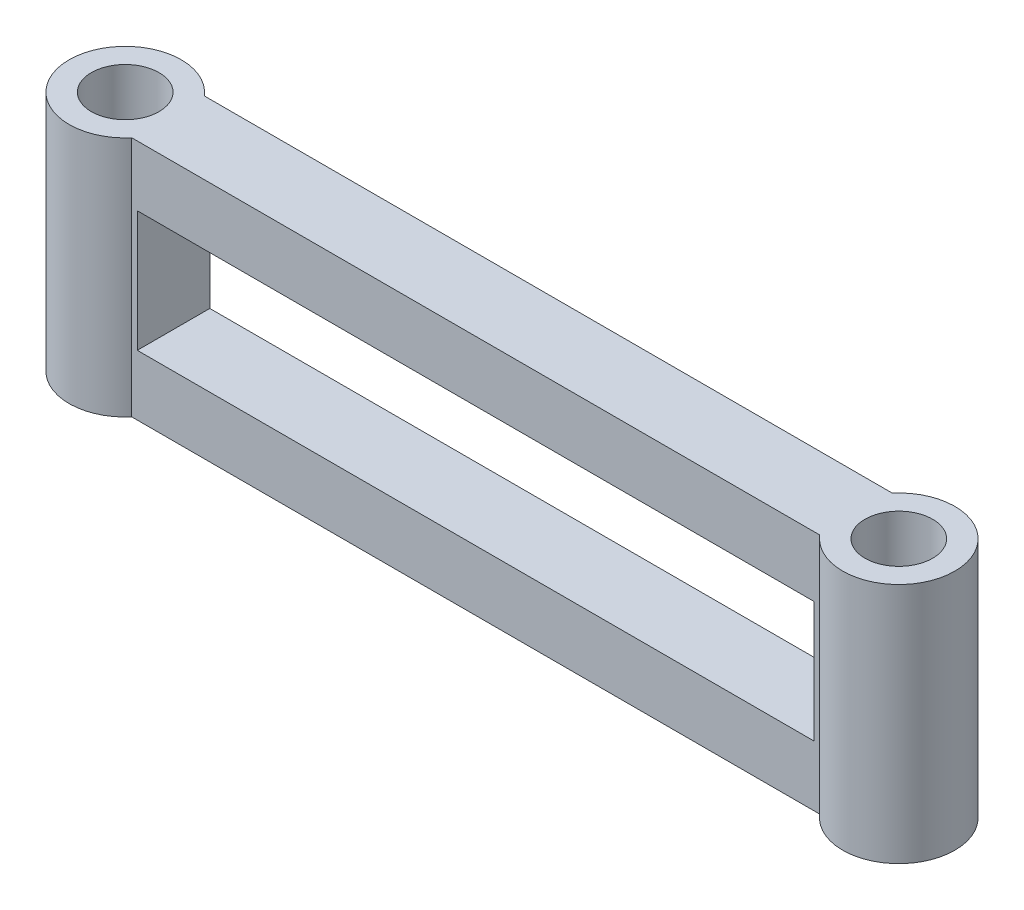
ISO-10303-21;
HEADER;
FILE_DESCRIPTION(('STEP AP214'),'2;1');
FILE_NAME('part.step','',(''),(''),'','','');
FILE_SCHEMA(('AUTOMOTIVE_DESIGN { 1 0 10303 214 1 1 1 1 }'));
ENDSEC;
DATA;
#1=APPLICATION_CONTEXT('core data for automotive mechanical design processes');
#2=APPLICATION_PROTOCOL_DEFINITION('international standard','automotive_design',2000,#1);
#3=PRODUCT_CONTEXT('',#1,'mechanical');
#4=PRODUCT('Part','Part','',(#3));
#5=PRODUCT_RELATED_PRODUCT_CATEGORY('part','',(#4));
#6=PRODUCT_DEFINITION_FORMATION('','',#4);
#7=PRODUCT_DEFINITION_CONTEXT('part definition',#1,'design');
#8=PRODUCT_DEFINITION('design','',#6,#7);
#9=PRODUCT_DEFINITION_SHAPE('','',#8);
#10=(LENGTH_UNIT() NAMED_UNIT(*) SI_UNIT(.MILLI.,.METRE.));
#11=(NAMED_UNIT(*) PLANE_ANGLE_UNIT() SI_UNIT($,.RADIAN.));
#12=(NAMED_UNIT(*) SI_UNIT($,.STERADIAN.) SOLID_ANGLE_UNIT());
#13=UNCERTAINTY_MEASURE_WITH_UNIT(LENGTH_MEASURE(1.E-05),#10,'distance_accuracy_value','');
#14=(GEOMETRIC_REPRESENTATION_CONTEXT(3) GLOBAL_UNCERTAINTY_ASSIGNED_CONTEXT((#13)) GLOBAL_UNIT_ASSIGNED_CONTEXT((#10,
#11,#12)) REPRESENTATION_CONTEXT('',''));
#15=CARTESIAN_POINT('',(0.,0.,0.));
#16=DIRECTION('',(0.,0.,1.));
#17=DIRECTION('',(1.,0.,0.));
#18=AXIS2_PLACEMENT_3D('',#15,#16,#17);
#19=CARTESIAN_POINT('',(-101.6,63.5,-49.5042105698021));
#20=DIRECTION('',(0.,1.,0.));
#21=DIRECTION('',(0.,0.,1.));
#22=AXIS2_PLACEMENT_3D('',#19,#20,#21);
#23=PLANE('',#22);
#24=CARTESIAN_POINT('',(-101.6,63.5,-49.5042105698021));
#25=DIRECTION('',(0.,1.,0.));
#26=DIRECTION('',(0.,0.,1.));
#27=AXIS2_PLACEMENT_3D('',#24,#25,#26);
#28=CIRCLE('',#27,8.88999999999998);
#29=CARTESIAN_POINT('',(-101.6,63.5,-40.6142105698022));
#30=VERTEX_POINT('',#29);
#31=EDGE_CURVE('E136',#30,#30,#28,.T.);
#32=ORIENTED_EDGE('',*,*,#31,.F.);
#33=EDGE_LOOP('',(#32));
#34=FACE_BOUND('',#33,.T.);
#35=CARTESIAN_POINT('',(-101.6,63.5,-49.5042105698021));
#36=DIRECTION('',(0.,1.,0.));
#37=DIRECTION('',(0.,0.,1.));
#38=AXIS2_PLACEMENT_3D('',#35,#36,#37);
#39=CIRCLE('',#38,14.732);
#40=CARTESIAN_POINT('',(-90.3613969284434,63.5,-59.0292105698021));
#41=VERTEX_POINT('',#40);
#42=CARTESIAN_POINT('',(-90.3613969284434,63.5,-39.9792105698021));
#43=VERTEX_POINT('',#42);
#44=EDGE_CURVE('E142',#41,#43,#39,.T.);
#45=ORIENTED_EDGE('',*,*,#44,.T.);
#46=DIRECTION('',(1.,0.,0.));
#47=VECTOR('',#46,1.);
#48=CARTESIAN_POINT('',(-90.3613969284434,63.5,-39.9792105698021));
#49=LINE('',#48,#47);
#50=CARTESIAN_POINT('',(90.3613969284435,63.5,-39.9792105698022));
#51=VERTEX_POINT('',#50);
#52=EDGE_CURVE('E145',#43,#51,#49,.T.);
#53=ORIENTED_EDGE('',*,*,#52,.T.);
#54=CARTESIAN_POINT('',(101.6,63.5,-49.5042105698021));
#55=DIRECTION('',(0.,1.,0.));
#56=DIRECTION('',(0.,0.,1.));
#57=AXIS2_PLACEMENT_3D('',#54,#55,#56);
#58=CIRCLE('',#57,14.732);
#59=CARTESIAN_POINT('',(90.3613969284435,63.5,-59.0292105698021));
#60=VERTEX_POINT('',#59);
#61=EDGE_CURVE('E148',#51,#60,#58,.T.);
#62=ORIENTED_EDGE('',*,*,#61,.T.);
#63=DIRECTION('',(-1.,0.,0.));
#64=VECTOR('',#63,1.);
#65=CARTESIAN_POINT('',(-90.3613969284434,63.5,-59.0292105698021));
#66=LINE('',#65,#64);
#67=EDGE_CURVE('E150',#60,#41,#66,.T.);
#68=ORIENTED_EDGE('',*,*,#67,.T.);
#69=EDGE_LOOP('',(#45,#53,#62,#68));
#70=FACE_BOUND('',#69,.T.);
#71=CARTESIAN_POINT('',(101.6,63.5,-49.5042105698021));
#72=DIRECTION('',(0.,1.,0.));
#73=DIRECTION('',(0.,0.,1.));
#74=AXIS2_PLACEMENT_3D('',#71,#72,#73);
#75=CIRCLE('',#74,8.88999999999999);
#76=CARTESIAN_POINT('',(101.6,63.5,-40.6142105698022));
#77=VERTEX_POINT('',#76);
#78=EDGE_CURVE('E130',#77,#77,#75,.T.);
#79=ORIENTED_EDGE('',*,*,#78,.F.);
#80=EDGE_LOOP('',(#79));
#81=FACE_BOUND('',#80,.T.);
#82=ADVANCED_FACE('F36',(#34,#70,#81),#23,.T.);
#83=CARTESIAN_POINT('',(-101.6,0.,-49.5042105698021));
#84=DIRECTION('',(0.,1.,0.));
#85=DIRECTION('',(0.,0.,1.));
#86=AXIS2_PLACEMENT_3D('',#83,#84,#85);
#87=PLANE('',#86);
#88=CARTESIAN_POINT('',(-101.6,0.,-49.5042105698021));
#89=DIRECTION('',(0.,1.,0.));
#90=DIRECTION('',(0.,0.,1.));
#91=AXIS2_PLACEMENT_3D('',#88,#89,#90);
#92=CIRCLE('',#91,14.732);
#93=CARTESIAN_POINT('',(-90.3613969284434,0.,-59.0292105698021));
#94=VERTEX_POINT('',#93);
#95=CARTESIAN_POINT('',(-90.3613969284434,0.,-39.9792105698021));
#96=VERTEX_POINT('',#95);
#97=EDGE_CURVE('E139',#94,#96,#92,.T.);
#98=ORIENTED_EDGE('',*,*,#97,.F.);
#99=DIRECTION('',(-1.,0.,0.));
#100=VECTOR('',#99,1.);
#101=CARTESIAN_POINT('',(-90.3613969284434,0.,-59.0292105698021));
#102=LINE('',#101,#100);
#103=CARTESIAN_POINT('',(90.3613969284435,0.,-59.0292105698021));
#104=VERTEX_POINT('',#103);
#105=EDGE_CURVE('E146',#104,#94,#102,.T.);
#106=ORIENTED_EDGE('',*,*,#105,.F.);
#107=CARTESIAN_POINT('',(101.6,0.,-49.5042105698021));
#108=DIRECTION('',(0.,1.,0.));
#109=DIRECTION('',(0.,0.,1.));
#110=AXIS2_PLACEMENT_3D('',#107,#108,#109);
#111=CIRCLE('',#110,14.732);
#112=CARTESIAN_POINT('',(90.3613969284435,0.,-39.9792105698022));
#113=VERTEX_POINT('',#112);
#114=EDGE_CURVE('E157',#113,#104,#111,.T.);
#115=ORIENTED_EDGE('',*,*,#114,.F.);
#116=DIRECTION('',(1.,0.,0.));
#117=VECTOR('',#116,1.);
#118=CARTESIAN_POINT('',(-90.3613969284434,0.,-39.9792105698021));
#119=LINE('',#118,#117);
#120=EDGE_CURVE('E155',#96,#113,#119,.T.);
#121=ORIENTED_EDGE('',*,*,#120,.F.);
#122=EDGE_LOOP('',(#98,#106,#115,#121));
#123=FACE_BOUND('',#122,.T.);
#124=CARTESIAN_POINT('',(-101.6,0.,-49.5042105698021));
#125=DIRECTION('',(0.,1.,0.));
#126=DIRECTION('',(0.,0.,1.));
#127=AXIS2_PLACEMENT_3D('',#124,#125,#126);
#128=CIRCLE('',#127,8.88999999999998);
#129=CARTESIAN_POINT('',(-101.6,0.,-40.6142105698022));
#130=VERTEX_POINT('',#129);
#131=EDGE_CURVE('E133',#130,#130,#128,.T.);
#132=ORIENTED_EDGE('',*,*,#131,.T.);
#133=EDGE_LOOP('',(#132));
#134=FACE_BOUND('',#133,.T.);
#135=CARTESIAN_POINT('',(101.6,0.,-49.5042105698021));
#136=DIRECTION('',(0.,1.,0.));
#137=DIRECTION('',(0.,0.,1.));
#138=AXIS2_PLACEMENT_3D('',#135,#136,#137);
#139=CIRCLE('',#138,8.88999999999999);
#140=CARTESIAN_POINT('',(101.6,0.,-40.6142105698022));
#141=VERTEX_POINT('',#140);
#142=EDGE_CURVE('E127',#141,#141,#139,.T.);
#143=ORIENTED_EDGE('',*,*,#142,.T.);
#144=EDGE_LOOP('',(#143));
#145=FACE_BOUND('',#144,.T.);
#146=ADVANCED_FACE('F194',(#123,#134,#145),#87,.F.);
#147=CARTESIAN_POINT('',(-101.6,63.5,-49.5042105698021));
#148=DIRECTION('',(0.,-1.,0.));
#149=DIRECTION('',(0.,0.,-1.));
#150=AXIS2_PLACEMENT_3D('',#147,#148,#149);
#151=CYLINDRICAL_SURFACE('',#150,14.732);
#152=ORIENTED_EDGE('',*,*,#97,.T.);
#153=DIRECTION('',(0.,-1.,0.));
#154=VECTOR('',#153,1.);
#155=CARTESIAN_POINT('',(-90.3613969284434,63.5,-39.9792105698021));
#156=LINE('',#155,#154);
#157=EDGE_CURVE('E168',#43,#96,#156,.T.);
#158=ORIENTED_EDGE('',*,*,#157,.F.);
#159=ORIENTED_EDGE('',*,*,#44,.F.);
#160=DIRECTION('',(0.,-1.,0.));
#161=VECTOR('',#160,1.);
#162=CARTESIAN_POINT('',(-90.3613969284434,63.5,-59.0292105698021));
#163=LINE('',#162,#161);
#164=EDGE_CURVE('E152',#41,#94,#163,.T.);
#165=ORIENTED_EDGE('',*,*,#164,.T.);
#166=EDGE_LOOP('',(#152,#158,#159,#165));
#167=FACE_BOUND('',#166,.T.);
#168=ADVANCED_FACE('F38',(#167),#151,.T.);
#169=CARTESIAN_POINT('',(-90.3613969284434,63.5,-39.9792105698021));
#170=DIRECTION('',(0.,0.,-1.));
#171=DIRECTION('',(-1.,0.,0.));
#172=AXIS2_PLACEMENT_3D('',#169,#170,#171);
#173=PLANE('',#172);
#174=DIRECTION('',(1.,0.,0.));
#175=VECTOR('',#174,1.);
#176=CARTESIAN_POINT('',(-88.9,15.875,-39.9792105698021));
#177=LINE('',#176,#175);
#178=CARTESIAN_POINT('',(-88.9,15.875,-39.9792105698021));
#179=VERTEX_POINT('',#178);
#180=CARTESIAN_POINT('',(88.9,15.875,-39.9792105698021));
#181=VERTEX_POINT('',#180);
#182=EDGE_CURVE('E113',#179,#181,#177,.T.);
#183=ORIENTED_EDGE('',*,*,#182,.F.);
#184=DIRECTION('',(0.,-1.,0.));
#185=VECTOR('',#184,1.);
#186=CARTESIAN_POINT('',(-88.9,47.625,-39.9792105698021));
#187=LINE('',#186,#185);
#188=CARTESIAN_POINT('',(-88.9,47.625,-39.9792105698021));
#189=VERTEX_POINT('',#188);
#190=EDGE_CURVE('E51',#189,#179,#187,.T.);
#191=ORIENTED_EDGE('',*,*,#190,.F.);
#192=DIRECTION('',(-1.,0.,0.));
#193=VECTOR('',#192,1.);
#194=CARTESIAN_POINT('',(-88.9,47.625,-39.9792105698021));
#195=LINE('',#194,#193);
#196=CARTESIAN_POINT('',(88.9,47.625,-39.9792105698021));
#197=VERTEX_POINT('',#196);
#198=EDGE_CURVE('E120',#197,#189,#195,.T.);
#199=ORIENTED_EDGE('',*,*,#198,.F.);
#200=DIRECTION('',(0.,1.,0.));
#201=VECTOR('',#200,1.);
#202=CARTESIAN_POINT('',(88.9,47.625,-39.9792105698021));
#203=LINE('',#202,#201);
#204=EDGE_CURVE('E104',#181,#197,#203,.T.);
#205=ORIENTED_EDGE('',*,*,#204,.F.);
#206=EDGE_LOOP('',(#183,#191,#199,#205));
#207=FACE_BOUND('',#206,.T.);
#208=ORIENTED_EDGE('',*,*,#120,.T.);
#209=DIRECTION('',(0.,-1.,0.));
#210=VECTOR('',#209,1.);
#211=CARTESIAN_POINT('',(90.3613969284435,63.5,-39.9792105698022));
#212=LINE('',#211,#210);
#213=EDGE_CURVE('E165',#51,#113,#212,.T.);
#214=ORIENTED_EDGE('',*,*,#213,.F.);
#215=ORIENTED_EDGE('',*,*,#52,.F.);
#216=ORIENTED_EDGE('',*,*,#157,.T.);
#217=EDGE_LOOP('',(#208,#214,#215,#216));
#218=FACE_BOUND('',#217,.T.);
#219=ADVANCED_FACE('F117',(#207,#218),#173,.F.);
#220=CARTESIAN_POINT('',(101.6,63.5,-49.5042105698021));
#221=DIRECTION('',(0.,-1.,0.));
#222=DIRECTION('',(0.,0.,-1.));
#223=AXIS2_PLACEMENT_3D('',#220,#221,#222);
#224=CYLINDRICAL_SURFACE('',#223,14.732);
#225=ORIENTED_EDGE('',*,*,#114,.T.);
#226=DIRECTION('',(0.,-1.,0.));
#227=VECTOR('',#226,1.);
#228=CARTESIAN_POINT('',(90.3613969284435,63.5,-59.0292105698021));
#229=LINE('',#228,#227);
#230=EDGE_CURVE('E162',#60,#104,#229,.T.);
#231=ORIENTED_EDGE('',*,*,#230,.F.);
#232=ORIENTED_EDGE('',*,*,#61,.F.);
#233=ORIENTED_EDGE('',*,*,#213,.T.);
#234=EDGE_LOOP('',(#225,#231,#232,#233));
#235=FACE_BOUND('',#234,.T.);
#236=ADVANCED_FACE('F208',(#235),#224,.T.);
#237=CARTESIAN_POINT('',(-90.3613969284434,63.5,-59.0292105698021));
#238=DIRECTION('',(0.,0.,1.));
#239=DIRECTION('',(1.,0.,0.));
#240=AXIS2_PLACEMENT_3D('',#237,#238,#239);
#241=PLANE('',#240);
#242=DIRECTION('',(-1.,0.,0.));
#243=VECTOR('',#242,1.);
#244=CARTESIAN_POINT('',(-90.3613969284434,47.625,-59.0292105698021));
#245=LINE('',#244,#243);
#246=CARTESIAN_POINT('',(88.9,47.625,-59.0292105698021));
#247=VERTEX_POINT('',#246);
#248=CARTESIAN_POINT('',(-88.9,47.625,-59.0292105698021));
#249=VERTEX_POINT('',#248);
#250=EDGE_CURVE('E44',#247,#249,#245,.T.);
#251=ORIENTED_EDGE('',*,*,#250,.T.);
#252=DIRECTION('',(0.,-1.,0.));
#253=VECTOR('',#252,1.);
#254=CARTESIAN_POINT('',(-88.9,63.5,-59.0292105698021));
#255=LINE('',#254,#253);
#256=CARTESIAN_POINT('',(-88.9,15.875,-59.0292105698021));
#257=VERTEX_POINT('',#256);
#258=EDGE_CURVE('E11',#249,#257,#255,.T.);
#259=ORIENTED_EDGE('',*,*,#258,.T.);
#260=DIRECTION('',(1.,0.,0.));
#261=VECTOR('',#260,1.);
#262=CARTESIAN_POINT('',(-90.3613969284434,15.875,-59.0292105698021));
#263=LINE('',#262,#261);
#264=CARTESIAN_POINT('',(88.9,15.875,-59.0292105698021));
#265=VERTEX_POINT('',#264);
#266=EDGE_CURVE('E171',#257,#265,#263,.T.);
#267=ORIENTED_EDGE('',*,*,#266,.T.);
#268=DIRECTION('',(0.,1.,0.));
#269=VECTOR('',#268,1.);
#270=CARTESIAN_POINT('',(88.9,63.5000000000001,-59.0292105698021));
#271=LINE('',#270,#269);
#272=EDGE_CURVE('E107',#265,#247,#271,.T.);
#273=ORIENTED_EDGE('',*,*,#272,.T.);
#274=EDGE_LOOP('',(#251,#259,#267,#273));
#275=FACE_BOUND('',#274,.T.);
#276=ORIENTED_EDGE('',*,*,#105,.T.);
#277=ORIENTED_EDGE('',*,*,#164,.F.);
#278=ORIENTED_EDGE('',*,*,#67,.F.);
#279=ORIENTED_EDGE('',*,*,#230,.T.);
#280=EDGE_LOOP('',(#276,#277,#278,#279));
#281=FACE_BOUND('',#280,.T.);
#282=ADVANCED_FACE('F175',(#275,#281),#241,.F.);
#283=CARTESIAN_POINT('',(-101.6,63.5,-49.5042105698021));
#284=DIRECTION('',(0.,-1.,0.));
#285=DIRECTION('',(0.,0.,-1.));
#286=AXIS2_PLACEMENT_3D('',#283,#284,#285);
#287=CYLINDRICAL_SURFACE('',#286,8.88999999999998);
#288=ORIENTED_EDGE('',*,*,#31,.T.);
#289=EDGE_LOOP('',(#288));
#290=FACE_BOUND('',#289,.T.);
#291=ORIENTED_EDGE('',*,*,#131,.F.);
#292=EDGE_LOOP('',(#291));
#293=FACE_BOUND('',#292,.T.);
#294=ADVANCED_FACE('F189',(#290,#293),#287,.F.);
#295=CARTESIAN_POINT('',(101.6,63.5,-49.5042105698021));
#296=DIRECTION('',(0.,-1.,0.));
#297=DIRECTION('',(0.,0.,-1.));
#298=AXIS2_PLACEMENT_3D('',#295,#296,#297);
#299=CYLINDRICAL_SURFACE('',#298,8.88999999999999);
#300=ORIENTED_EDGE('',*,*,#78,.T.);
#301=EDGE_LOOP('',(#300));
#302=FACE_BOUND('',#301,.T.);
#303=ORIENTED_EDGE('',*,*,#142,.F.);
#304=EDGE_LOOP('',(#303));
#305=FACE_BOUND('',#304,.T.);
#306=ADVANCED_FACE('F182',(#302,#305),#299,.F.);
#307=CARTESIAN_POINT('',(-88.9,47.625,-64.2362105698022));
#308=DIRECTION('',(-1.,0.,0.));
#309=DIRECTION('',(0.,0.,1.));
#310=AXIS2_PLACEMENT_3D('',#307,#308,#309);
#311=PLANE('',#310);
#312=DIRECTION('',(0.,0.,1.));
#313=VECTOR('',#312,1.);
#314=CARTESIAN_POINT('',(-88.9,47.625,-64.2362105698022));
#315=LINE('',#314,#313);
#316=EDGE_CURVE('E125',#249,#189,#315,.T.);
#317=ORIENTED_EDGE('',*,*,#316,.T.);
#318=ORIENTED_EDGE('',*,*,#190,.T.);
#319=DIRECTION('',(0.,0.,1.));
#320=VECTOR('',#319,1.);
#321=CARTESIAN_POINT('',(-88.9,15.875,-64.2362105698022));
#322=LINE('',#321,#320);
#323=EDGE_CURVE('E110',#257,#179,#322,.T.);
#324=ORIENTED_EDGE('',*,*,#323,.F.);
#325=ORIENTED_EDGE('',*,*,#258,.F.);
#326=EDGE_LOOP('',(#317,#318,#324,#325));
#327=FACE_BOUND('',#326,.T.);
#328=ADVANCED_FACE('F180',(#327),#311,.F.);
#329=CARTESIAN_POINT('',(-88.9,47.625,-64.2362105698022));
#330=DIRECTION('',(0.,1.,0.));
#331=DIRECTION('',(0.,0.,1.));
#332=AXIS2_PLACEMENT_3D('',#329,#330,#331);
#333=PLANE('',#332);
#334=DIRECTION('',(0.,0.,1.));
#335=VECTOR('',#334,1.);
#336=CARTESIAN_POINT('',(88.9,47.625,-64.2362105698022));
#337=LINE('',#336,#335);
#338=EDGE_CURVE('E109',#247,#197,#337,.T.);
#339=ORIENTED_EDGE('',*,*,#338,.T.);
#340=ORIENTED_EDGE('',*,*,#198,.T.);
#341=ORIENTED_EDGE('',*,*,#316,.F.);
#342=ORIENTED_EDGE('',*,*,#250,.F.);
#343=EDGE_LOOP('',(#339,#340,#341,#342));
#344=FACE_BOUND('',#343,.T.);
#345=ADVANCED_FACE('F179',(#344),#333,.F.);
#346=CARTESIAN_POINT('',(88.9,47.625,-64.2362105698022));
#347=DIRECTION('',(1.,0.,0.));
#348=DIRECTION('',(0.,1.,0.));
#349=AXIS2_PLACEMENT_3D('',#346,#347,#348);
#350=PLANE('',#349);
#351=DIRECTION('',(0.,0.,1.));
#352=VECTOR('',#351,1.);
#353=CARTESIAN_POINT('',(88.9,15.875,-64.2362105698022));
#354=LINE('',#353,#352);
#355=EDGE_CURVE('E59',#265,#181,#354,.T.);
#356=ORIENTED_EDGE('',*,*,#355,.T.);
#357=ORIENTED_EDGE('',*,*,#204,.T.);
#358=ORIENTED_EDGE('',*,*,#338,.F.);
#359=ORIENTED_EDGE('',*,*,#272,.F.);
#360=EDGE_LOOP('',(#356,#357,#358,#359));
#361=FACE_BOUND('',#360,.T.);
#362=ADVANCED_FACE('F101',(#361),#350,.F.);
#363=CARTESIAN_POINT('',(-88.9,15.875,-64.2362105698022));
#364=DIRECTION('',(0.,-1.,0.));
#365=DIRECTION('',(0.,0.,-1.));
#366=AXIS2_PLACEMENT_3D('',#363,#364,#365);
#367=PLANE('',#366);
#368=ORIENTED_EDGE('',*,*,#323,.T.);
#369=ORIENTED_EDGE('',*,*,#182,.T.);
#370=ORIENTED_EDGE('',*,*,#355,.F.);
#371=ORIENTED_EDGE('',*,*,#266,.F.);
#372=EDGE_LOOP('',(#368,#369,#370,#371));
#373=FACE_BOUND('',#372,.T.);
#374=ADVANCED_FACE('F114',(#373),#367,.F.);
#375=CLOSED_SHELL('',(#82,#146,#168,#219,#236,#282,#294,#306,#328,#345,#362,#374));
#376=MANIFOLD_SOLID_BREP('B2',#375);
#377=ADVANCED_BREP_SHAPE_REPRESENTATION('',(#18,#376),#14);
#378=SHAPE_DEFINITION_REPRESENTATION(#9,#377);
ENDSEC;
END-ISO-10303-21;
